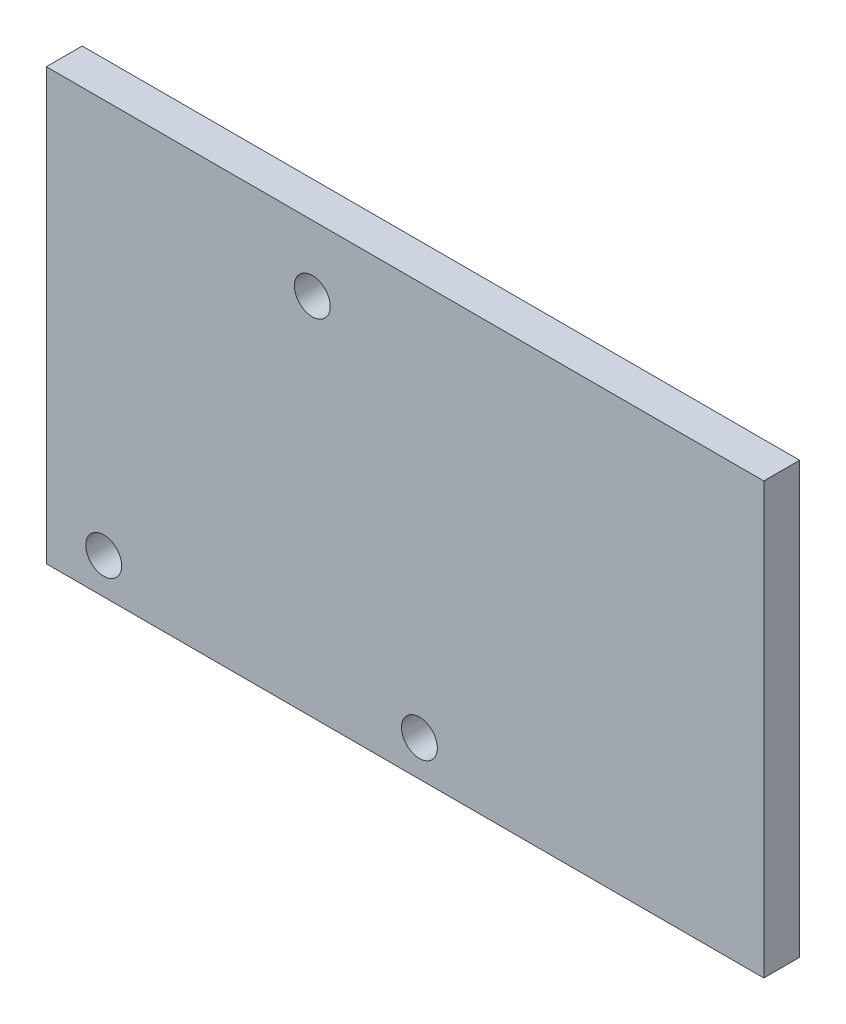
ISO-10303-21;
HEADER;
FILE_DESCRIPTION(('STEP AP214'),'2;1');
FILE_NAME('part.step','',(''),(''),'','','');
FILE_SCHEMA(('AUTOMOTIVE_DESIGN { 1 0 10303 214 1 1 1 1 }'));
ENDSEC;
DATA;
#1=APPLICATION_CONTEXT('core data for automotive mechanical design processes');
#2=APPLICATION_PROTOCOL_DEFINITION('international standard','automotive_design',2000,#1);
#3=PRODUCT_CONTEXT('',#1,'mechanical');
#4=PRODUCT('Part','Part','',(#3));
#5=PRODUCT_RELATED_PRODUCT_CATEGORY('part','',(#4));
#6=PRODUCT_DEFINITION_FORMATION('','',#4);
#7=PRODUCT_DEFINITION_CONTEXT('part definition',#1,'design');
#8=PRODUCT_DEFINITION('design','',#6,#7);
#9=PRODUCT_DEFINITION_SHAPE('','',#8);
#10=(LENGTH_UNIT() NAMED_UNIT(*) SI_UNIT(.MILLI.,.METRE.));
#11=(NAMED_UNIT(*) PLANE_ANGLE_UNIT() SI_UNIT($,.RADIAN.));
#12=(NAMED_UNIT(*) SI_UNIT($,.STERADIAN.) SOLID_ANGLE_UNIT());
#13=UNCERTAINTY_MEASURE_WITH_UNIT(LENGTH_MEASURE(1.E-05),#10,'distance_accuracy_value','');
#14=(GEOMETRIC_REPRESENTATION_CONTEXT(3) GLOBAL_UNCERTAINTY_ASSIGNED_CONTEXT((#13)) GLOBAL_UNIT_ASSIGNED_CONTEXT((#10,
#11,#12)) REPRESENTATION_CONTEXT('',''));
#15=CARTESIAN_POINT('',(0.,0.,0.));
#16=DIRECTION('',(0.,0.,1.));
#17=DIRECTION('',(1.,0.,0.));
#18=AXIS2_PLACEMENT_3D('',#15,#16,#17);
#19=CARTESIAN_POINT('',(0.,0.,6.35));
#20=DIRECTION('',(-1.,0.,0.));
#21=DIRECTION('',(0.,-1.,0.));
#22=AXIS2_PLACEMENT_3D('',#19,#20,#21);
#23=PLANE('',#22);
#24=DIRECTION('',(0.,1.,0.));
#25=VECTOR('',#24,1.);
#26=CARTESIAN_POINT('',(0.,0.,0.));
#27=LINE('',#26,#25);
#28=CARTESIAN_POINT('',(0.,0.,0.));
#29=VERTEX_POINT('',#28);
#30=CARTESIAN_POINT('',(0.,76.2,0.));
#31=VERTEX_POINT('',#30);
#32=EDGE_CURVE('E100',#29,#31,#27,.T.);
#33=ORIENTED_EDGE('',*,*,#32,.T.);
#34=DIRECTION('',(0.,0.,-1.));
#35=VECTOR('',#34,1.);
#36=CARTESIAN_POINT('',(0.,76.2,6.35));
#37=LINE('',#36,#35);
#38=CARTESIAN_POINT('',(0.,76.2,6.35));
#39=VERTEX_POINT('',#38);
#40=EDGE_CURVE('E11',#39,#31,#37,.T.);
#41=ORIENTED_EDGE('',*,*,#40,.F.);
#42=DIRECTION('',(0.,1.,0.));
#43=VECTOR('',#42,1.);
#44=CARTESIAN_POINT('',(0.,0.,6.35));
#45=LINE('',#44,#43);
#46=CARTESIAN_POINT('',(0.,0.,6.35));
#47=VERTEX_POINT('',#46);
#48=EDGE_CURVE('E87',#47,#39,#45,.T.);
#49=ORIENTED_EDGE('',*,*,#48,.F.);
#50=DIRECTION('',(0.,0.,-1.));
#51=VECTOR('',#50,1.);
#52=CARTESIAN_POINT('',(0.,0.,6.35));
#53=LINE('',#52,#51);
#54=EDGE_CURVE('E96',#47,#29,#53,.T.);
#55=ORIENTED_EDGE('',*,*,#54,.T.);
#56=EDGE_LOOP('',(#33,#41,#49,#55));
#57=FACE_BOUND('',#56,.T.);
#58=ADVANCED_FACE('F35',(#57),#23,.F.);
#59=CARTESIAN_POINT('',(0.,76.2,6.35));
#60=DIRECTION('',(0.,-1.,0.));
#61=DIRECTION('',(1.,0.,0.));
#62=AXIS2_PLACEMENT_3D('',#59,#60,#61);
#63=PLANE('',#62);
#64=DIRECTION('',(-1.,0.,0.));
#65=VECTOR('',#64,1.);
#66=CARTESIAN_POINT('',(0.,76.2,0.));
#67=LINE('',#66,#65);
#68=CARTESIAN_POINT('',(-127.,76.2,0.));
#69=VERTEX_POINT('',#68);
#70=EDGE_CURVE('E91',#31,#69,#67,.T.);
#71=ORIENTED_EDGE('',*,*,#70,.T.);
#72=DIRECTION('',(0.,0.,-1.));
#73=VECTOR('',#72,1.);
#74=CARTESIAN_POINT('',(-127.,76.2,6.35));
#75=LINE('',#74,#73);
#76=CARTESIAN_POINT('',(-127.,76.2,6.35));
#77=VERTEX_POINT('',#76);
#78=EDGE_CURVE('E44',#77,#69,#75,.T.);
#79=ORIENTED_EDGE('',*,*,#78,.F.);
#80=DIRECTION('',(-1.,0.,0.));
#81=VECTOR('',#80,1.);
#82=CARTESIAN_POINT('',(0.,76.2,6.35));
#83=LINE('',#82,#81);
#84=EDGE_CURVE('E82',#39,#77,#83,.T.);
#85=ORIENTED_EDGE('',*,*,#84,.F.);
#86=ORIENTED_EDGE('',*,*,#40,.T.);
#87=EDGE_LOOP('',(#71,#79,#85,#86));
#88=FACE_BOUND('',#87,.T.);
#89=ADVANCED_FACE('F90',(#88),#63,.F.);
#90=CARTESIAN_POINT('',(-127.,0.,6.35));
#91=DIRECTION('',(1.,0.,0.));
#92=DIRECTION('',(0.,0.,-1.));
#93=AXIS2_PLACEMENT_3D('',#90,#91,#92);
#94=PLANE('',#93);
#95=DIRECTION('',(0.,-1.,0.));
#96=VECTOR('',#95,1.);
#97=CARTESIAN_POINT('',(-127.,0.,0.));
#98=LINE('',#97,#96);
#99=CARTESIAN_POINT('',(-127.,0.,0.));
#100=VERTEX_POINT('',#99);
#101=EDGE_CURVE('E69',#69,#100,#98,.T.);
#102=ORIENTED_EDGE('',*,*,#101,.T.);
#103=DIRECTION('',(0.,0.,-1.));
#104=VECTOR('',#103,1.);
#105=CARTESIAN_POINT('',(-127.,0.,6.35));
#106=LINE('',#105,#104);
#107=CARTESIAN_POINT('',(-127.,0.,6.35));
#108=VERTEX_POINT('',#107);
#109=EDGE_CURVE('E92',#108,#100,#106,.T.);
#110=ORIENTED_EDGE('',*,*,#109,.F.);
#111=DIRECTION('',(0.,-1.,0.));
#112=VECTOR('',#111,1.);
#113=CARTESIAN_POINT('',(-127.,0.,6.35));
#114=LINE('',#113,#112);
#115=EDGE_CURVE('E85',#77,#108,#114,.T.);
#116=ORIENTED_EDGE('',*,*,#115,.F.);
#117=ORIENTED_EDGE('',*,*,#78,.T.);
#118=EDGE_LOOP('',(#102,#110,#116,#117));
#119=FACE_BOUND('',#118,.T.);
#120=ADVANCED_FACE('F94',(#119),#94,.F.);
#121=CARTESIAN_POINT('',(0.,0.,6.35));
#122=DIRECTION('',(0.,1.,0.));
#123=DIRECTION('',(-1.,0.,0.));
#124=AXIS2_PLACEMENT_3D('',#121,#122,#123);
#125=PLANE('',#124);
#126=DIRECTION('',(1.,0.,0.));
#127=VECTOR('',#126,1.);
#128=CARTESIAN_POINT('',(0.,0.,0.));
#129=LINE('',#128,#127);
#130=EDGE_CURVE('E75',#100,#29,#129,.T.);
#131=ORIENTED_EDGE('',*,*,#130,.T.);
#132=ORIENTED_EDGE('',*,*,#54,.F.);
#133=DIRECTION('',(1.,0.,0.));
#134=VECTOR('',#133,1.);
#135=CARTESIAN_POINT('',(0.,0.,6.35));
#136=LINE('',#135,#134);
#137=EDGE_CURVE('E52',#108,#47,#136,.T.);
#138=ORIENTED_EDGE('',*,*,#137,.F.);
#139=ORIENTED_EDGE('',*,*,#109,.T.);
#140=EDGE_LOOP('',(#131,#132,#138,#139));
#141=FACE_BOUND('',#140,.T.);
#142=ADVANCED_FACE('F107',(#141),#125,.F.);
#143=CARTESIAN_POINT('',(0.,0.,6.35));
#144=DIRECTION('',(0.,0.,1.));
#145=DIRECTION('',(1.,0.,0.));
#146=AXIS2_PLACEMENT_3D('',#143,#144,#145);
#147=PLANE('',#146);
#148=CARTESIAN_POINT('',(-116.84,6.34999999999999,6.35));
#149=DIRECTION('',(0.,0.,-1.));
#150=DIRECTION('',(-1.,0.,0.));
#151=AXIS2_PLACEMENT_3D('',#148,#149,#150);
#152=CIRCLE('',#151,3.175);
#153=CARTESIAN_POINT('',(-120.015,6.34999999999999,6.35));
#154=VERTEX_POINT('',#153);
#155=EDGE_CURVE('E125',#154,#154,#152,.T.);
#156=ORIENTED_EDGE('',*,*,#155,.T.);
#157=EDGE_LOOP('',(#156));
#158=FACE_BOUND('',#157,.T.);
#159=CARTESIAN_POINT('',(-60.96,6.34999999999999,6.35));
#160=DIRECTION('',(0.,0.,-1.));
#161=DIRECTION('',(-1.,0.,0.));
#162=AXIS2_PLACEMENT_3D('',#159,#160,#161);
#163=CIRCLE('',#162,3.175);
#164=CARTESIAN_POINT('',(-64.135,6.34999999999999,6.35));
#165=VERTEX_POINT('',#164);
#166=EDGE_CURVE('E116',#165,#165,#163,.T.);
#167=ORIENTED_EDGE('',*,*,#166,.T.);
#168=EDGE_LOOP('',(#167));
#169=FACE_BOUND('',#168,.T.);
#170=CARTESIAN_POINT('',(-79.912500047,64.5730381646381,6.35));
#171=DIRECTION('',(0.,0.,-1.));
#172=DIRECTION('',(-1.,0.,0.));
#173=AXIS2_PLACEMENT_3D('',#170,#171,#172);
#174=CIRCLE('',#173,3.175);
#175=CARTESIAN_POINT('',(-83.087500047,64.5730381646381,6.35));
#176=VERTEX_POINT('',#175);
#177=EDGE_CURVE('E113',#176,#176,#174,.T.);
#178=ORIENTED_EDGE('',*,*,#177,.T.);
#179=EDGE_LOOP('',(#178));
#180=FACE_BOUND('',#179,.T.);
#181=ORIENTED_EDGE('',*,*,#48,.T.);
#182=ORIENTED_EDGE('',*,*,#84,.T.);
#183=ORIENTED_EDGE('',*,*,#115,.T.);
#184=ORIENTED_EDGE('',*,*,#137,.T.);
#185=EDGE_LOOP('',(#181,#182,#183,#184));
#186=FACE_BOUND('',#185,.T.);
#187=ADVANCED_FACE('F83',(#158,#169,#180,#186),#147,.T.);
#188=CARTESIAN_POINT('',(0.,0.,0.));
#189=DIRECTION('',(0.,0.,1.));
#190=DIRECTION('',(1.,0.,0.));
#191=AXIS2_PLACEMENT_3D('',#188,#189,#190);
#192=PLANE('',#191);
#193=CARTESIAN_POINT('',(-116.84,6.34999999999999,0.));
#194=DIRECTION('',(0.,0.,-1.));
#195=DIRECTION('',(-1.,0.,0.));
#196=AXIS2_PLACEMENT_3D('',#193,#194,#195);
#197=CIRCLE('',#196,3.80999999999999);
#198=CARTESIAN_POINT('',(-120.65,6.34999999999999,0.));
#199=VERTEX_POINT('',#198);
#200=EDGE_CURVE('E131',#199,#199,#197,.T.);
#201=ORIENTED_EDGE('',*,*,#200,.F.);
#202=EDGE_LOOP('',(#201));
#203=FACE_BOUND('',#202,.T.);
#204=CARTESIAN_POINT('',(-60.96,6.34999999999999,0.));
#205=DIRECTION('',(0.,0.,-1.));
#206=DIRECTION('',(-1.,0.,0.));
#207=AXIS2_PLACEMENT_3D('',#204,#205,#206);
#208=CIRCLE('',#207,3.81);
#209=CARTESIAN_POINT('',(-64.77,6.34999999999999,0.));
#210=VERTEX_POINT('',#209);
#211=EDGE_CURVE('E122',#210,#210,#208,.T.);
#212=ORIENTED_EDGE('',*,*,#211,.F.);
#213=EDGE_LOOP('',(#212));
#214=FACE_BOUND('',#213,.T.);
#215=CARTESIAN_POINT('',(-79.912500047,64.5730381646381,0.));
#216=DIRECTION('',(0.,0.,1.));
#217=DIRECTION('',(1.,0.,0.));
#218=AXIS2_PLACEMENT_3D('',#215,#216,#217);
#219=CIRCLE('',#218,3.175);
#220=CARTESIAN_POINT('',(-76.737500047,64.5730381646381,0.));
#221=VERTEX_POINT('',#220);
#222=EDGE_CURVE('E38',#221,#221,#219,.T.);
#223=ORIENTED_EDGE('',*,*,#222,.T.);
#224=EDGE_LOOP('',(#223));
#225=FACE_BOUND('',#224,.T.);
#226=ORIENTED_EDGE('',*,*,#32,.F.);
#227=ORIENTED_EDGE('',*,*,#130,.F.);
#228=ORIENTED_EDGE('',*,*,#101,.F.);
#229=ORIENTED_EDGE('',*,*,#70,.F.);
#230=EDGE_LOOP('',(#226,#227,#228,#229));
#231=FACE_BOUND('',#230,.T.);
#232=ADVANCED_FACE('F110',(#203,#214,#225,#231),#192,.F.);
#233=CARTESIAN_POINT('',(-79.912500047,64.5730381646381,6.35));
#234=DIRECTION('',(0.,0.,-1.));
#235=DIRECTION('',(-1.,0.,0.));
#236=AXIS2_PLACEMENT_3D('',#233,#234,#235);
#237=CYLINDRICAL_SURFACE('',#236,3.175);
#238=ORIENTED_EDGE('',*,*,#177,.F.);
#239=EDGE_LOOP('',(#238));
#240=FACE_BOUND('',#239,.T.);
#241=ORIENTED_EDGE('',*,*,#222,.F.);
#242=EDGE_LOOP('',(#241));
#243=FACE_BOUND('',#242,.T.);
#244=ADVANCED_FACE('F139',(#240,#243),#237,.F.);
#245=CARTESIAN_POINT('',(-60.96,6.34999999999999,0.));
#246=DIRECTION('',(0.,0.,-1.));
#247=DIRECTION('',(-1.,0.,0.));
#248=AXIS2_PLACEMENT_3D('',#245,#246,#247);
#249=CYLINDRICAL_SURFACE('',#248,3.175);
#250=ORIENTED_EDGE('',*,*,#166,.F.);
#251=EDGE_LOOP('',(#250));
#252=FACE_BOUND('',#251,.T.);
#253=CARTESIAN_POINT('',(-60.96,6.34999999999999,0.635));
#254=DIRECTION('',(0.,0.,-1.));
#255=DIRECTION('',(-1.,0.,0.));
#256=AXIS2_PLACEMENT_3D('',#253,#254,#255);
#257=CIRCLE('',#256,3.175);
#258=CARTESIAN_POINT('',(-64.135,6.34999999999999,0.635));
#259=VERTEX_POINT('',#258);
#260=EDGE_CURVE('E119',#259,#259,#257,.T.);
#261=ORIENTED_EDGE('',*,*,#260,.T.);
#262=EDGE_LOOP('',(#261));
#263=FACE_BOUND('',#262,.T.);
#264=ADVANCED_FACE('F147',(#252,#263),#249,.F.);
#265=CARTESIAN_POINT('',(-60.96,6.34999999999999,0.));
#266=DIRECTION('',(0.,0.,-1.));
#267=DIRECTION('',(-1.,0.,0.));
#268=AXIS2_PLACEMENT_3D('',#265,#266,#267);
#269=CONICAL_SURFACE('',#268,3.81,0.78539816339745);
#270=ORIENTED_EDGE('',*,*,#260,.F.);
#271=EDGE_LOOP('',(#270));
#272=FACE_BOUND('',#271,.T.);
#273=ORIENTED_EDGE('',*,*,#211,.T.);
#274=EDGE_LOOP('',(#273));
#275=FACE_BOUND('',#274,.T.);
#276=ADVANCED_FACE('F153',(#272,#275),#269,.F.);
#277=CARTESIAN_POINT('',(-116.84,6.34999999999999,0.));
#278=DIRECTION('',(0.,0.,-1.));
#279=DIRECTION('',(-1.,0.,0.));
#280=AXIS2_PLACEMENT_3D('',#277,#278,#279);
#281=CYLINDRICAL_SURFACE('',#280,3.175);
#282=ORIENTED_EDGE('',*,*,#155,.F.);
#283=EDGE_LOOP('',(#282));
#284=FACE_BOUND('',#283,.T.);
#285=CARTESIAN_POINT('',(-116.84,6.34999999999999,0.635));
#286=DIRECTION('',(0.,0.,-1.));
#287=DIRECTION('',(-1.,0.,0.));
#288=AXIS2_PLACEMENT_3D('',#285,#286,#287);
#289=CIRCLE('',#288,3.175);
#290=CARTESIAN_POINT('',(-120.015,6.34999999999999,0.635));
#291=VERTEX_POINT('',#290);
#292=EDGE_CURVE('E128',#291,#291,#289,.T.);
#293=ORIENTED_EDGE('',*,*,#292,.T.);
#294=EDGE_LOOP('',(#293));
#295=FACE_BOUND('',#294,.T.);
#296=ADVANCED_FACE('F181',(#284,#295),#281,.F.);
#297=CARTESIAN_POINT('',(-116.84,6.34999999999999,0.));
#298=DIRECTION('',(0.,0.,-1.));
#299=DIRECTION('',(-1.,0.,0.));
#300=AXIS2_PLACEMENT_3D('',#297,#298,#299);
#301=CONICAL_SURFACE('',#300,3.80999999999999,0.785398163397444);
#302=ORIENTED_EDGE('',*,*,#292,.F.);
#303=EDGE_LOOP('',(#302));
#304=FACE_BOUND('',#303,.T.);
#305=ORIENTED_EDGE('',*,*,#200,.T.);
#306=EDGE_LOOP('',(#305));
#307=FACE_BOUND('',#306,.T.);
#308=ADVANCED_FACE('F135',(#304,#307),#301,.F.);
#309=CLOSED_SHELL('',(#58,#89,#120,#142,#187,#232,#244,#264,#276,#296,#308));
#310=MANIFOLD_SOLID_BREP('B2',#309);
#311=ADVANCED_BREP_SHAPE_REPRESENTATION('',(#18,#310),#14);
#312=SHAPE_DEFINITION_REPRESENTATION(#9,#311);
ENDSEC;
END-ISO-10303-21;
